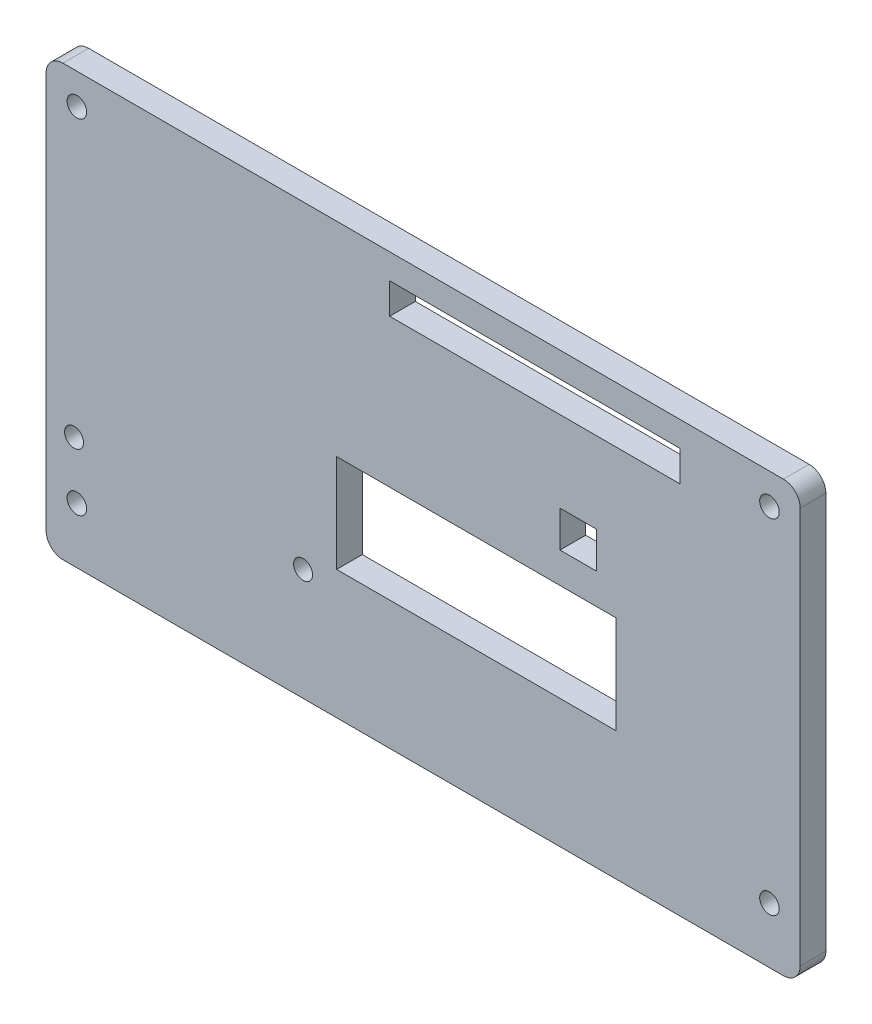
ISO-10303-21;
HEADER;
FILE_DESCRIPTION(('STEP AP214'),'2;1');
FILE_NAME('part.step','',(''),(''),'','','');
FILE_SCHEMA(('AUTOMOTIVE_DESIGN { 1 0 10303 214 1 1 1 1 }'));
ENDSEC;
DATA;
#1=APPLICATION_CONTEXT('core data for automotive mechanical design processes');
#2=APPLICATION_PROTOCOL_DEFINITION('international standard','automotive_design',2000,#1);
#3=PRODUCT_CONTEXT('',#1,'mechanical');
#4=PRODUCT('Part','Part','',(#3));
#5=PRODUCT_RELATED_PRODUCT_CATEGORY('part','',(#4));
#6=PRODUCT_DEFINITION_FORMATION('','',#4);
#7=PRODUCT_DEFINITION_CONTEXT('part definition',#1,'design');
#8=PRODUCT_DEFINITION('design','',#6,#7);
#9=PRODUCT_DEFINITION_SHAPE('','',#8);
#10=(LENGTH_UNIT() NAMED_UNIT(*) SI_UNIT(.MILLI.,.METRE.));
#11=(NAMED_UNIT(*) PLANE_ANGLE_UNIT() SI_UNIT($,.RADIAN.));
#12=(NAMED_UNIT(*) SI_UNIT($,.STERADIAN.) SOLID_ANGLE_UNIT());
#13=UNCERTAINTY_MEASURE_WITH_UNIT(LENGTH_MEASURE(1.E-05),#10,'distance_accuracy_value','');
#14=(GEOMETRIC_REPRESENTATION_CONTEXT(3) GLOBAL_UNCERTAINTY_ASSIGNED_CONTEXT((#13)) GLOBAL_UNIT_ASSIGNED_CONTEXT((#10,
#11,#12)) REPRESENTATION_CONTEXT('',''));
#15=CARTESIAN_POINT('',(0.,0.,0.));
#16=DIRECTION('',(0.,0.,1.));
#17=DIRECTION('',(1.,0.,0.));
#18=AXIS2_PLACEMENT_3D('',#15,#16,#17);
#19=CARTESIAN_POINT('',(7.92481365266042,79.0360065363824,4.6));
#20=DIRECTION('',(0.,0.,1.));
#21=DIRECTION('',(1.,0.,0.));
#22=AXIS2_PLACEMENT_3D('',#19,#20,#21);
#23=PLANE('',#22);
#24=CARTESIAN_POINT('',(50.9248136526604,25.0360065363824,4.6));
#25=DIRECTION('',(0.,0.,-1.));
#26=DIRECTION('',(-1.,0.,0.));
#27=AXIS2_PLACEMENT_3D('',#24,#25,#26);
#28=CIRCLE('',#27,1.7);
#29=CARTESIAN_POINT('',(49.2248136526604,25.0360065363824,4.6));
#30=VERTEX_POINT('',#29);
#31=EDGE_CURVE('E584',#30,#30,#28,.T.);
#32=ORIENTED_EDGE('',*,*,#31,.T.);
#33=EDGE_LOOP('',(#32));
#34=FACE_BOUND('',#33,.T.);
#35=CARTESIAN_POINT('',(9.92481365266042,25.0360065363824,4.6));
#36=DIRECTION('',(0.,0.,-1.));
#37=DIRECTION('',(-1.,0.,0.));
#38=AXIS2_PLACEMENT_3D('',#35,#36,#37);
#39=CIRCLE('',#38,1.7);
#40=CARTESIAN_POINT('',(8.22481365266042,25.0360065363824,4.6));
#41=VERTEX_POINT('',#40);
#42=EDGE_CURVE('E588',#41,#41,#39,.T.);
#43=ORIENTED_EDGE('',*,*,#42,.T.);
#44=EDGE_LOOP('',(#43));
#45=FACE_BOUND('',#44,.T.);
#46=CARTESIAN_POINT('',(10.4248136526604,15.0360065363824,4.6));
#47=DIRECTION('',(0.,0.,1.));
#48=DIRECTION('',(1.,0.,0.));
#49=AXIS2_PLACEMENT_3D('',#46,#47,#48);
#50=CIRCLE('',#49,1.75);
#51=CARTESIAN_POINT('',(12.1748136526604,15.0360065363824,4.6));
#52=VERTEX_POINT('',#51);
#53=EDGE_CURVE('E604',#52,#52,#50,.T.);
#54=ORIENTED_EDGE('',*,*,#53,.F.);
#55=EDGE_LOOP('',(#54));
#56=FACE_BOUND('',#55,.T.);
#57=CARTESIAN_POINT('',(134.42481365266,76.5360065363824,4.6));
#58=DIRECTION('',(0.,0.,1.));
#59=DIRECTION('',(1.,0.,0.));
#60=AXIS2_PLACEMENT_3D('',#57,#58,#59);
#61=CIRCLE('',#60,1.75);
#62=CARTESIAN_POINT('',(136.17481365266,76.5360065363824,4.6));
#63=VERTEX_POINT('',#62);
#64=EDGE_CURVE('E203',#63,#63,#61,.T.);
#65=ORIENTED_EDGE('',*,*,#64,.F.);
#66=EDGE_LOOP('',(#65));
#67=FACE_BOUND('',#66,.T.);
#68=CARTESIAN_POINT('',(7.92481365266042,79.0360065363824,4.6));
#69=DIRECTION('',(0.,0.,1.));
#70=DIRECTION('',(1.,0.,0.));
#71=AXIS2_PLACEMENT_3D('',#68,#69,#70);
#72=CIRCLE('',#71,3.);
#73=CARTESIAN_POINT('',(7.92481365266042,82.0360065363824,4.6));
#74=VERTEX_POINT('',#73);
#75=CARTESIAN_POINT('',(4.92481365266042,79.0360065363824,4.6));
#76=VERTEX_POINT('',#75);
#77=EDGE_CURVE('E275',#74,#76,#72,.T.);
#78=ORIENTED_EDGE('',*,*,#77,.T.);
#79=DIRECTION('',(0.,-1.,0.));
#80=VECTOR('',#79,1.);
#81=CARTESIAN_POINT('',(4.92481365266042,8.03600653638239,4.6));
#82=LINE('',#81,#80);
#83=CARTESIAN_POINT('',(4.92481365266042,8.03600653638239,4.6));
#84=VERTEX_POINT('',#83);
#85=EDGE_CURVE('E278',#76,#84,#82,.T.);
#86=ORIENTED_EDGE('',*,*,#85,.T.);
#87=CARTESIAN_POINT('',(7.92481365266042,8.03600653638239,4.6));
#88=DIRECTION('',(0.,0.,1.));
#89=DIRECTION('',(1.,0.,0.));
#90=AXIS2_PLACEMENT_3D('',#87,#88,#89);
#91=CIRCLE('',#90,3.);
#92=CARTESIAN_POINT('',(7.92481365266042,5.03600653638239,4.6));
#93=VERTEX_POINT('',#92);
#94=EDGE_CURVE('E281',#84,#93,#91,.T.);
#95=ORIENTED_EDGE('',*,*,#94,.T.);
#96=DIRECTION('',(1.,0.,0.));
#97=VECTOR('',#96,1.);
#98=CARTESIAN_POINT('',(136.92481365266,5.03600653638239,4.6));
#99=LINE('',#98,#97);
#100=CARTESIAN_POINT('',(136.92481365266,5.03600653638239,4.6));
#101=VERTEX_POINT('',#100);
#102=EDGE_CURVE('E283',#93,#101,#99,.T.);
#103=ORIENTED_EDGE('',*,*,#102,.T.);
#104=CARTESIAN_POINT('',(136.92481365266,8.0360065363824,4.6));
#105=DIRECTION('',(0.,0.,1.));
#106=DIRECTION('',(1.,0.,0.));
#107=AXIS2_PLACEMENT_3D('',#104,#105,#106);
#108=CIRCLE('',#107,3.);
#109=CARTESIAN_POINT('',(139.92481365266,8.03600653638239,4.6));
#110=VERTEX_POINT('',#109);
#111=EDGE_CURVE('E285',#101,#110,#108,.T.);
#112=ORIENTED_EDGE('',*,*,#111,.T.);
#113=DIRECTION('',(0.,1.,0.));
#114=VECTOR('',#113,1.);
#115=CARTESIAN_POINT('',(139.92481365266,79.0360065363824,4.6));
#116=LINE('',#115,#114);
#117=CARTESIAN_POINT('',(139.92481365266,79.0360065363824,4.6));
#118=VERTEX_POINT('',#117);
#119=EDGE_CURVE('E287',#110,#118,#116,.T.);
#120=ORIENTED_EDGE('',*,*,#119,.T.);
#121=CARTESIAN_POINT('',(136.92481365266,79.0360065363824,4.6));
#122=DIRECTION('',(0.,0.,1.));
#123=DIRECTION('',(1.,0.,0.));
#124=AXIS2_PLACEMENT_3D('',#121,#122,#123);
#125=CIRCLE('',#124,3.);
#126=CARTESIAN_POINT('',(136.92481365266,82.0360065363824,4.6));
#127=VERTEX_POINT('',#126);
#128=EDGE_CURVE('E289',#118,#127,#125,.T.);
#129=ORIENTED_EDGE('',*,*,#128,.T.);
#130=DIRECTION('',(-1.,0.,0.));
#131=VECTOR('',#130,1.);
#132=CARTESIAN_POINT('',(7.92481365266042,82.0360065363824,4.6));
#133=LINE('',#132,#131);
#134=EDGE_CURVE('E291',#127,#74,#133,.T.);
#135=ORIENTED_EDGE('',*,*,#134,.T.);
#136=EDGE_LOOP('',(#78,#86,#95,#103,#112,#120,#129,#135));
#137=FACE_BOUND('',#136,.T.);
#138=DIRECTION('',(1.,0.,0.));
#139=VECTOR('',#138,1.);
#140=CARTESIAN_POINT('',(118.42481365266,72.0360065363824,4.6));
#141=LINE('',#140,#139);
#142=CARTESIAN_POINT('',(66.4248136526604,72.0360065363824,4.6));
#143=VERTEX_POINT('',#142);
#144=CARTESIAN_POINT('',(118.42481365266,72.0360065363824,4.6));
#145=VERTEX_POINT('',#144);
#146=EDGE_CURVE('E246',#143,#145,#141,.T.);
#147=ORIENTED_EDGE('',*,*,#146,.F.);
#148=DIRECTION('',(0.,-1.,0.));
#149=VECTOR('',#148,1.);
#150=CARTESIAN_POINT('',(66.4248136526604,72.0360065363824,4.6));
#151=LINE('',#150,#149);
#152=CARTESIAN_POINT('',(66.4248136526604,77.5360065363824,4.6));
#153=VERTEX_POINT('',#152);
#154=EDGE_CURVE('E244',#153,#143,#151,.T.);
#155=ORIENTED_EDGE('',*,*,#154,.F.);
#156=DIRECTION('',(-1.,0.,0.));
#157=VECTOR('',#156,1.);
#158=CARTESIAN_POINT('',(66.4248136526604,77.5360065363824,4.6));
#159=LINE('',#158,#157);
#160=CARTESIAN_POINT('',(118.42481365266,77.5360065363824,4.6));
#161=VERTEX_POINT('',#160);
#162=EDGE_CURVE('E252',#161,#153,#159,.T.);
#163=ORIENTED_EDGE('',*,*,#162,.F.);
#164=DIRECTION('',(0.,1.,0.));
#165=VECTOR('',#164,1.);
#166=CARTESIAN_POINT('',(118.42481365266,77.5360065363824,4.6));
#167=LINE('',#166,#165);
#168=EDGE_CURVE('E249',#145,#161,#167,.T.);
#169=ORIENTED_EDGE('',*,*,#168,.F.);
#170=EDGE_LOOP('',(#147,#155,#163,#169));
#171=FACE_BOUND('',#170,.T.);
#172=DIRECTION('',(1.,0.,0.));
#173=VECTOR('',#172,1.);
#174=CARTESIAN_POINT('',(106.92481365266,28.0360065363824,4.6));
#175=LINE('',#174,#173);
#176=CARTESIAN_POINT('',(56.9248136526604,28.0360065363824,4.6));
#177=VERTEX_POINT('',#176);
#178=CARTESIAN_POINT('',(106.92481365266,28.0360065363824,4.6));
#179=VERTEX_POINT('',#178);
#180=EDGE_CURVE('E215',#177,#179,#175,.T.);
#181=ORIENTED_EDGE('',*,*,#180,.F.);
#182=DIRECTION('',(0.,-1.,0.));
#183=VECTOR('',#182,1.);
#184=CARTESIAN_POINT('',(56.9248136526604,28.0360065363824,4.6));
#185=LINE('',#184,#183);
#186=CARTESIAN_POINT('',(56.9248136526604,45.5360065363824,4.6));
#187=VERTEX_POINT('',#186);
#188=EDGE_CURVE('E213',#187,#177,#185,.T.);
#189=ORIENTED_EDGE('',*,*,#188,.F.);
#190=DIRECTION('',(-1.,0.,0.));
#191=VECTOR('',#190,1.);
#192=CARTESIAN_POINT('',(56.9248136526604,45.5360065363824,4.6));
#193=LINE('',#192,#191);
#194=CARTESIAN_POINT('',(106.92481365266,45.5360065363824,4.6));
#195=VERTEX_POINT('',#194);
#196=EDGE_CURVE('E221',#195,#187,#193,.T.);
#197=ORIENTED_EDGE('',*,*,#196,.F.);
#198=DIRECTION('',(0.,1.,0.));
#199=VECTOR('',#198,1.);
#200=CARTESIAN_POINT('',(106.92481365266,45.5360065363824,4.6));
#201=LINE('',#200,#199);
#202=EDGE_CURVE('E218',#179,#195,#201,.T.);
#203=ORIENTED_EDGE('',*,*,#202,.F.);
#204=EDGE_LOOP('',(#181,#189,#197,#203));
#205=FACE_BOUND('',#204,.T.);
#206=DIRECTION('',(1.,0.,0.));
#207=VECTOR('',#206,1.);
#208=CARTESIAN_POINT('',(103.42481365266,51.0360065363824,4.6));
#209=LINE('',#208,#207);
#210=CARTESIAN_POINT('',(96.9248136526604,51.0360065363824,4.6));
#211=VERTEX_POINT('',#210);
#212=CARTESIAN_POINT('',(103.42481365266,51.0360065363824,4.6));
#213=VERTEX_POINT('',#212);
#214=EDGE_CURVE('E182',#211,#213,#209,.T.);
#215=ORIENTED_EDGE('',*,*,#214,.F.);
#216=DIRECTION('',(0.,-1.,0.));
#217=VECTOR('',#216,1.);
#218=CARTESIAN_POINT('',(96.9248136526604,51.0360065363824,4.6));
#219=LINE('',#218,#217);
#220=CARTESIAN_POINT('',(96.9248136526604,57.5360065363824,4.6));
#221=VERTEX_POINT('',#220);
#222=EDGE_CURVE('E174',#221,#211,#219,.T.);
#223=ORIENTED_EDGE('',*,*,#222,.F.);
#224=DIRECTION('',(-1.,0.,0.));
#225=VECTOR('',#224,1.);
#226=CARTESIAN_POINT('',(96.9248136526604,57.5360065363824,4.6));
#227=LINE('',#226,#225);
#228=CARTESIAN_POINT('',(103.42481365266,57.5360065363824,4.6));
#229=VERTEX_POINT('',#228);
#230=EDGE_CURVE('E197',#229,#221,#227,.T.);
#231=ORIENTED_EDGE('',*,*,#230,.F.);
#232=DIRECTION('',(0.,1.,0.));
#233=VECTOR('',#232,1.);
#234=CARTESIAN_POINT('',(103.42481365266,57.5360065363824,4.6));
#235=LINE('',#234,#233);
#236=EDGE_CURVE('E195',#213,#229,#235,.T.);
#237=ORIENTED_EDGE('',*,*,#236,.F.);
#238=EDGE_LOOP('',(#215,#223,#231,#237));
#239=FACE_BOUND('',#238,.T.);
#240=CARTESIAN_POINT('',(10.4248136526604,76.5360065363824,4.6));
#241=DIRECTION('',(0.,0.,1.));
#242=DIRECTION('',(1.,0.,0.));
#243=AXIS2_PLACEMENT_3D('',#240,#241,#242);
#244=CIRCLE('',#243,1.75);
#245=CARTESIAN_POINT('',(12.1748136526604,76.5360065363824,4.6));
#246=VERTEX_POINT('',#245);
#247=EDGE_CURVE('E610',#246,#246,#244,.T.);
#248=ORIENTED_EDGE('',*,*,#247,.F.);
#249=EDGE_LOOP('',(#248));
#250=FACE_BOUND('',#249,.T.);
#251=CARTESIAN_POINT('',(134.42481365266,15.0360065363824,4.6));
#252=DIRECTION('',(0.,0.,1.));
#253=DIRECTION('',(1.,0.,0.));
#254=AXIS2_PLACEMENT_3D('',#251,#252,#253);
#255=CIRCLE('',#254,1.75000000000001);
#256=CARTESIAN_POINT('',(136.17481365266,15.0360065363824,4.6));
#257=VERTEX_POINT('',#256);
#258=EDGE_CURVE('E598',#257,#257,#255,.T.);
#259=ORIENTED_EDGE('',*,*,#258,.F.);
#260=EDGE_LOOP('',(#259));
#261=FACE_BOUND('',#260,.T.);
#262=ADVANCED_FACE('F37',(#34,#45,#56,#67,#137,#171,#205,#239,#250,#261),#23,.T.);
#263=CARTESIAN_POINT('',(7.92481365266042,79.0360065363824,0.));
#264=DIRECTION('',(0.,0.,1.));
#265=DIRECTION('',(1.,0.,0.));
#266=AXIS2_PLACEMENT_3D('',#263,#264,#265);
#267=PLANE('',#266);
#268=CARTESIAN_POINT('',(50.9248136526604,25.0360065363824,0.));
#269=DIRECTION('',(0.,0.,-1.));
#270=DIRECTION('',(-1.,0.,0.));
#271=AXIS2_PLACEMENT_3D('',#268,#269,#270);
#272=CIRCLE('',#271,1.7);
#273=CARTESIAN_POINT('',(49.2248136526604,25.0360065363824,0.));
#274=VERTEX_POINT('',#273);
#275=EDGE_CURVE('E587',#274,#274,#272,.T.);
#276=ORIENTED_EDGE('',*,*,#275,.F.);
#277=EDGE_LOOP('',(#276));
#278=FACE_BOUND('',#277,.T.);
#279=CARTESIAN_POINT('',(9.92481365266042,25.0360065363824,0.));
#280=DIRECTION('',(0.,0.,-1.));
#281=DIRECTION('',(-1.,0.,0.));
#282=AXIS2_PLACEMENT_3D('',#279,#280,#281);
#283=CIRCLE('',#282,1.7);
#284=CARTESIAN_POINT('',(8.22481365266042,25.0360065363824,0.));
#285=VERTEX_POINT('',#284);
#286=EDGE_CURVE('E593',#285,#285,#283,.T.);
#287=ORIENTED_EDGE('',*,*,#286,.F.);
#288=EDGE_LOOP('',(#287));
#289=FACE_BOUND('',#288,.T.);
#290=DIRECTION('',(0.,-1.,0.));
#291=VECTOR('',#290,1.);
#292=CARTESIAN_POINT('',(56.9248136526604,28.0360065363824,0.));
#293=LINE('',#292,#291);
#294=CARTESIAN_POINT('',(56.9248136526604,45.5360065363824,0.));
#295=VERTEX_POINT('',#294);
#296=CARTESIAN_POINT('',(56.9248136526604,28.0360065363824,0.));
#297=VERTEX_POINT('',#296);
#298=EDGE_CURVE('E190',#295,#297,#293,.T.);
#299=ORIENTED_EDGE('',*,*,#298,.T.);
#300=DIRECTION('',(1.,0.,0.));
#301=VECTOR('',#300,1.);
#302=CARTESIAN_POINT('',(106.92481365266,28.0360065363824,0.));
#303=LINE('',#302,#301);
#304=CARTESIAN_POINT('',(106.92481365266,28.0360065363824,0.));
#305=VERTEX_POINT('',#304);
#306=EDGE_CURVE('E226',#297,#305,#303,.T.);
#307=ORIENTED_EDGE('',*,*,#306,.T.);
#308=DIRECTION('',(0.,1.,0.));
#309=VECTOR('',#308,1.);
#310=CARTESIAN_POINT('',(106.92481365266,45.5360065363824,0.));
#311=LINE('',#310,#309);
#312=CARTESIAN_POINT('',(106.92481365266,45.5360065363824,0.));
#313=VERTEX_POINT('',#312);
#314=EDGE_CURVE('E229',#305,#313,#311,.T.);
#315=ORIENTED_EDGE('',*,*,#314,.T.);
#316=DIRECTION('',(-1.,0.,0.));
#317=VECTOR('',#316,1.);
#318=CARTESIAN_POINT('',(56.9248136526604,45.5360065363824,0.));
#319=LINE('',#318,#317);
#320=EDGE_CURVE('E216',#313,#295,#319,.T.);
#321=ORIENTED_EDGE('',*,*,#320,.T.);
#322=EDGE_LOOP('',(#299,#307,#315,#321));
#323=FACE_BOUND('',#322,.T.);
#324=CARTESIAN_POINT('',(7.92481365266042,79.0360065363824,0.));
#325=DIRECTION('',(0.,0.,1.));
#326=DIRECTION('',(1.,0.,0.));
#327=AXIS2_PLACEMENT_3D('',#324,#325,#326);
#328=CIRCLE('',#327,3.);
#329=CARTESIAN_POINT('',(7.92481365266042,82.0360065363824,0.));
#330=VERTEX_POINT('',#329);
#331=CARTESIAN_POINT('',(4.92481365266042,79.0360065363824,0.));
#332=VERTEX_POINT('',#331);
#333=EDGE_CURVE('E274',#330,#332,#328,.T.);
#334=ORIENTED_EDGE('',*,*,#333,.F.);
#335=DIRECTION('',(-1.,0.,0.));
#336=VECTOR('',#335,1.);
#337=CARTESIAN_POINT('',(7.92481365266042,82.0360065363824,0.));
#338=LINE('',#337,#336);
#339=CARTESIAN_POINT('',(136.92481365266,82.0360065363824,0.));
#340=VERTEX_POINT('',#339);
#341=EDGE_CURVE('E279',#340,#330,#338,.T.);
#342=ORIENTED_EDGE('',*,*,#341,.F.);
#343=CARTESIAN_POINT('',(136.92481365266,79.0360065363824,0.));
#344=DIRECTION('',(0.,0.,1.));
#345=DIRECTION('',(1.,0.,0.));
#346=AXIS2_PLACEMENT_3D('',#343,#344,#345);
#347=CIRCLE('',#346,3.);
#348=CARTESIAN_POINT('',(139.92481365266,79.0360065363824,0.));
#349=VERTEX_POINT('',#348);
#350=EDGE_CURVE('E306',#349,#340,#347,.T.);
#351=ORIENTED_EDGE('',*,*,#350,.F.);
#352=DIRECTION('',(0.,1.,0.));
#353=VECTOR('',#352,1.);
#354=CARTESIAN_POINT('',(139.92481365266,79.0360065363824,0.));
#355=LINE('',#354,#353);
#356=CARTESIAN_POINT('',(139.92481365266,8.03600653638239,0.));
#357=VERTEX_POINT('',#356);
#358=EDGE_CURVE('E304',#357,#349,#355,.T.);
#359=ORIENTED_EDGE('',*,*,#358,.F.);
#360=CARTESIAN_POINT('',(136.92481365266,8.0360065363824,0.));
#361=DIRECTION('',(0.,0.,1.));
#362=DIRECTION('',(1.,0.,0.));
#363=AXIS2_PLACEMENT_3D('',#360,#361,#362);
#364=CIRCLE('',#363,3.);
#365=CARTESIAN_POINT('',(136.92481365266,5.03600653638239,0.));
#366=VERTEX_POINT('',#365);
#367=EDGE_CURVE('E302',#366,#357,#364,.T.);
#368=ORIENTED_EDGE('',*,*,#367,.F.);
#369=DIRECTION('',(1.,0.,0.));
#370=VECTOR('',#369,1.);
#371=CARTESIAN_POINT('',(136.92481365266,5.03600653638239,0.));
#372=LINE('',#371,#370);
#373=CARTESIAN_POINT('',(7.92481365266042,5.03600653638239,0.));
#374=VERTEX_POINT('',#373);
#375=EDGE_CURVE('E300',#374,#366,#372,.T.);
#376=ORIENTED_EDGE('',*,*,#375,.F.);
#377=CARTESIAN_POINT('',(7.92481365266042,8.03600653638239,0.));
#378=DIRECTION('',(0.,0.,1.));
#379=DIRECTION('',(1.,0.,0.));
#380=AXIS2_PLACEMENT_3D('',#377,#378,#379);
#381=CIRCLE('',#380,3.);
#382=CARTESIAN_POINT('',(4.92481365266042,8.03600653638239,0.));
#383=VERTEX_POINT('',#382);
#384=EDGE_CURVE('E298',#383,#374,#381,.T.);
#385=ORIENTED_EDGE('',*,*,#384,.F.);
#386=DIRECTION('',(0.,-1.,0.));
#387=VECTOR('',#386,1.);
#388=CARTESIAN_POINT('',(4.92481365266042,8.03600653638239,0.));
#389=LINE('',#388,#387);
#390=EDGE_CURVE('E296',#332,#383,#389,.T.);
#391=ORIENTED_EDGE('',*,*,#390,.F.);
#392=EDGE_LOOP('',(#334,#342,#351,#359,#368,#376,#385,#391));
#393=FACE_BOUND('',#392,.T.);
#394=DIRECTION('',(0.,-1.,0.));
#395=VECTOR('',#394,1.);
#396=CARTESIAN_POINT('',(66.4248136526604,72.0360065363824,0.));
#397=LINE('',#396,#395);
#398=CARTESIAN_POINT('',(66.4248136526604,77.5360065363824,0.));
#399=VERTEX_POINT('',#398);
#400=CARTESIAN_POINT('',(66.4248136526604,72.0360065363824,0.));
#401=VERTEX_POINT('',#400);
#402=EDGE_CURVE('E243',#399,#401,#397,.T.);
#403=ORIENTED_EDGE('',*,*,#402,.T.);
#404=DIRECTION('',(1.,0.,0.));
#405=VECTOR('',#404,1.);
#406=CARTESIAN_POINT('',(118.42481365266,72.0360065363824,0.));
#407=LINE('',#406,#405);
#408=CARTESIAN_POINT('',(118.42481365266,72.0360065363824,0.));
#409=VERTEX_POINT('',#408);
#410=EDGE_CURVE('E257',#401,#409,#407,.T.);
#411=ORIENTED_EDGE('',*,*,#410,.T.);
#412=DIRECTION('',(0.,1.,0.));
#413=VECTOR('',#412,1.);
#414=CARTESIAN_POINT('',(118.42481365266,77.5360065363824,0.));
#415=LINE('',#414,#413);
#416=CARTESIAN_POINT('',(118.42481365266,77.5360065363824,0.));
#417=VERTEX_POINT('',#416);
#418=EDGE_CURVE('E260',#409,#417,#415,.T.);
#419=ORIENTED_EDGE('',*,*,#418,.T.);
#420=DIRECTION('',(-1.,0.,0.));
#421=VECTOR('',#420,1.);
#422=CARTESIAN_POINT('',(66.4248136526604,77.5360065363824,0.));
#423=LINE('',#422,#421);
#424=EDGE_CURVE('E247',#417,#399,#423,.T.);
#425=ORIENTED_EDGE('',*,*,#424,.T.);
#426=EDGE_LOOP('',(#403,#411,#419,#425));
#427=FACE_BOUND('',#426,.T.);
#428=DIRECTION('',(0.,-1.,0.));
#429=VECTOR('',#428,1.);
#430=CARTESIAN_POINT('',(96.9248136526604,51.0360065363824,0.));
#431=LINE('',#430,#429);
#432=CARTESIAN_POINT('',(96.9248136526604,57.5360065363824,0.));
#433=VERTEX_POINT('',#432);
#434=CARTESIAN_POINT('',(96.9248136526604,51.0360065363824,0.));
#435=VERTEX_POINT('',#434);
#436=EDGE_CURVE('E60',#433,#435,#431,.T.);
#437=ORIENTED_EDGE('',*,*,#436,.T.);
#438=DIRECTION('',(1.,0.,0.));
#439=VECTOR('',#438,1.);
#440=CARTESIAN_POINT('',(103.42481365266,51.0360065363824,0.));
#441=LINE('',#440,#439);
#442=CARTESIAN_POINT('',(103.42481365266,51.0360065363824,0.));
#443=VERTEX_POINT('',#442);
#444=EDGE_CURVE('E189',#435,#443,#441,.T.);
#445=ORIENTED_EDGE('',*,*,#444,.T.);
#446=DIRECTION('',(0.,1.,0.));
#447=VECTOR('',#446,1.);
#448=CARTESIAN_POINT('',(103.42481365266,57.5360065363824,0.));
#449=LINE('',#448,#447);
#450=CARTESIAN_POINT('',(103.42481365266,57.5360065363824,0.));
#451=VERTEX_POINT('',#450);
#452=EDGE_CURVE('E205',#443,#451,#449,.T.);
#453=ORIENTED_EDGE('',*,*,#452,.T.);
#454=DIRECTION('',(-1.,0.,0.));
#455=VECTOR('',#454,1.);
#456=CARTESIAN_POINT('',(96.9248136526604,57.5360065363824,0.));
#457=LINE('',#456,#455);
#458=EDGE_CURVE('E183',#451,#433,#457,.T.);
#459=ORIENTED_EDGE('',*,*,#458,.T.);
#460=EDGE_LOOP('',(#437,#445,#453,#459));
#461=FACE_BOUND('',#460,.T.);
#462=CARTESIAN_POINT('',(134.42481365266,76.5360065363824,0.));
#463=DIRECTION('',(0.,0.,1.));
#464=DIRECTION('',(1.,0.,0.));
#465=AXIS2_PLACEMENT_3D('',#462,#463,#464);
#466=CIRCLE('',#465,1.75);
#467=CARTESIAN_POINT('',(136.17481365266,76.5360065363824,0.));
#468=VERTEX_POINT('',#467);
#469=EDGE_CURVE('E613',#468,#468,#466,.T.);
#470=ORIENTED_EDGE('',*,*,#469,.T.);
#471=EDGE_LOOP('',(#470));
#472=FACE_BOUND('',#471,.T.);
#473=CARTESIAN_POINT('',(10.4248136526604,76.5360065363824,0.));
#474=DIRECTION('',(0.,0.,1.));
#475=DIRECTION('',(1.,0.,0.));
#476=AXIS2_PLACEMENT_3D('',#473,#474,#475);
#477=CIRCLE('',#476,1.75);
#478=CARTESIAN_POINT('',(12.1748136526604,76.5360065363824,0.));
#479=VERTEX_POINT('',#478);
#480=EDGE_CURVE('E607',#479,#479,#477,.T.);
#481=ORIENTED_EDGE('',*,*,#480,.T.);
#482=EDGE_LOOP('',(#481));
#483=FACE_BOUND('',#482,.T.);
#484=CARTESIAN_POINT('',(10.4248136526604,15.0360065363824,0.));
#485=DIRECTION('',(0.,0.,1.));
#486=DIRECTION('',(1.,0.,0.));
#487=AXIS2_PLACEMENT_3D('',#484,#485,#486);
#488=CIRCLE('',#487,1.75);
#489=CARTESIAN_POINT('',(12.1748136526604,15.0360065363824,0.));
#490=VERTEX_POINT('',#489);
#491=EDGE_CURVE('E601',#490,#490,#488,.T.);
#492=ORIENTED_EDGE('',*,*,#491,.T.);
#493=EDGE_LOOP('',(#492));
#494=FACE_BOUND('',#493,.T.);
#495=CARTESIAN_POINT('',(134.42481365266,15.0360065363824,0.));
#496=DIRECTION('',(0.,0.,1.));
#497=DIRECTION('',(1.,0.,0.));
#498=AXIS2_PLACEMENT_3D('',#495,#496,#497);
#499=CIRCLE('',#498,1.75000000000001);
#500=CARTESIAN_POINT('',(136.17481365266,15.0360065363824,0.));
#501=VERTEX_POINT('',#500);
#502=EDGE_CURVE('E590',#501,#501,#499,.T.);
#503=ORIENTED_EDGE('',*,*,#502,.T.);
#504=EDGE_LOOP('',(#503));
#505=FACE_BOUND('',#504,.T.);
#506=ADVANCED_FACE('F336',(#278,#289,#323,#393,#427,#461,#472,#483,#494,#505),#267,.F.);
#507=CARTESIAN_POINT('',(7.92481365266042,79.0360065363824,4.6));
#508=DIRECTION('',(0.,0.,-1.));
#509=DIRECTION('',(-1.,0.,0.));
#510=AXIS2_PLACEMENT_3D('',#507,#508,#509);
#511=CYLINDRICAL_SURFACE('',#510,3.);
#512=ORIENTED_EDGE('',*,*,#333,.T.);
#513=DIRECTION('',(0.,0.,-1.));
#514=VECTOR('',#513,1.);
#515=CARTESIAN_POINT('',(4.92481365266042,79.0360065363824,4.6));
#516=LINE('',#515,#514);
#517=EDGE_CURVE('E11',#76,#332,#516,.T.);
#518=ORIENTED_EDGE('',*,*,#517,.F.);
#519=ORIENTED_EDGE('',*,*,#77,.F.);
#520=DIRECTION('',(0.,0.,-1.));
#521=VECTOR('',#520,1.);
#522=CARTESIAN_POINT('',(7.92481365266042,82.0360065363824,4.6));
#523=LINE('',#522,#521);
#524=EDGE_CURVE('E293',#74,#330,#523,.T.);
#525=ORIENTED_EDGE('',*,*,#524,.T.);
#526=EDGE_LOOP('',(#512,#518,#519,#525));
#527=FACE_BOUND('',#526,.T.);
#528=ADVANCED_FACE('F39',(#527),#511,.T.);
#529=CARTESIAN_POINT('',(4.92481365266042,8.03600653638239,4.6));
#530=DIRECTION('',(1.,0.,0.));
#531=DIRECTION('',(0.,0.,-1.));
#532=AXIS2_PLACEMENT_3D('',#529,#530,#531);
#533=PLANE('',#532);
#534=ORIENTED_EDGE('',*,*,#390,.T.);
#535=DIRECTION('',(0.,0.,-1.));
#536=VECTOR('',#535,1.);
#537=CARTESIAN_POINT('',(4.92481365266042,8.03600653638239,4.6));
#538=LINE('',#537,#536);
#539=EDGE_CURVE('E45',#84,#383,#538,.T.);
#540=ORIENTED_EDGE('',*,*,#539,.F.);
#541=ORIENTED_EDGE('',*,*,#85,.F.);
#542=ORIENTED_EDGE('',*,*,#517,.T.);
#543=EDGE_LOOP('',(#534,#540,#541,#542));
#544=FACE_BOUND('',#543,.T.);
#545=ADVANCED_FACE('F354',(#544),#533,.F.);
#546=CARTESIAN_POINT('',(7.92481365266042,8.03600653638239,4.6));
#547=DIRECTION('',(0.,0.,-1.));
#548=DIRECTION('',(-1.,0.,0.));
#549=AXIS2_PLACEMENT_3D('',#546,#547,#548);
#550=CYLINDRICAL_SURFACE('',#549,3.);
#551=ORIENTED_EDGE('',*,*,#384,.T.);
#552=DIRECTION('',(0.,0.,-1.));
#553=VECTOR('',#552,1.);
#554=CARTESIAN_POINT('',(7.92481365266042,5.03600653638239,4.6));
#555=LINE('',#554,#553);
#556=EDGE_CURVE('E323',#93,#374,#555,.T.);
#557=ORIENTED_EDGE('',*,*,#556,.F.);
#558=ORIENTED_EDGE('',*,*,#94,.F.);
#559=ORIENTED_EDGE('',*,*,#539,.T.);
#560=EDGE_LOOP('',(#551,#557,#558,#559));
#561=FACE_BOUND('',#560,.T.);
#562=ADVANCED_FACE('F330',(#561),#550,.T.);
#563=CARTESIAN_POINT('',(136.92481365266,5.03600653638239,4.6));
#564=DIRECTION('',(0.,1.,0.));
#565=DIRECTION('',(0.,0.,1.));
#566=AXIS2_PLACEMENT_3D('',#563,#564,#565);
#567=PLANE('',#566);
#568=ORIENTED_EDGE('',*,*,#375,.T.);
#569=DIRECTION('',(0.,0.,-1.));
#570=VECTOR('',#569,1.);
#571=CARTESIAN_POINT('',(136.92481365266,5.03600653638239,4.6));
#572=LINE('',#571,#570);
#573=EDGE_CURVE('E320',#101,#366,#572,.T.);
#574=ORIENTED_EDGE('',*,*,#573,.F.);
#575=ORIENTED_EDGE('',*,*,#102,.F.);
#576=ORIENTED_EDGE('',*,*,#556,.T.);
#577=EDGE_LOOP('',(#568,#574,#575,#576));
#578=FACE_BOUND('',#577,.T.);
#579=ADVANCED_FACE('F342',(#578),#567,.F.);
#580=CARTESIAN_POINT('',(136.92481365266,8.0360065363824,4.6));
#581=DIRECTION('',(0.,0.,-1.));
#582=DIRECTION('',(-1.,0.,0.));
#583=AXIS2_PLACEMENT_3D('',#580,#581,#582);
#584=CYLINDRICAL_SURFACE('',#583,3.);
#585=ORIENTED_EDGE('',*,*,#367,.T.);
#586=DIRECTION('',(0.,0.,-1.));
#587=VECTOR('',#586,1.);
#588=CARTESIAN_POINT('',(139.92481365266,8.03600653638239,4.6));
#589=LINE('',#588,#587);
#590=EDGE_CURVE('E317',#110,#357,#589,.T.);
#591=ORIENTED_EDGE('',*,*,#590,.F.);
#592=ORIENTED_EDGE('',*,*,#111,.F.);
#593=ORIENTED_EDGE('',*,*,#573,.T.);
#594=EDGE_LOOP('',(#585,#591,#592,#593));
#595=FACE_BOUND('',#594,.T.);
#596=ADVANCED_FACE('F346',(#595),#584,.T.);
#597=CARTESIAN_POINT('',(139.92481365266,79.0360065363824,4.6));
#598=DIRECTION('',(-1.,0.,0.));
#599=DIRECTION('',(0.,0.,1.));
#600=AXIS2_PLACEMENT_3D('',#597,#598,#599);
#601=PLANE('',#600);
#602=ORIENTED_EDGE('',*,*,#358,.T.);
#603=DIRECTION('',(0.,0.,-1.));
#604=VECTOR('',#603,1.);
#605=CARTESIAN_POINT('',(139.92481365266,79.0360065363824,4.6));
#606=LINE('',#605,#604);
#607=EDGE_CURVE('E314',#118,#349,#606,.T.);
#608=ORIENTED_EDGE('',*,*,#607,.F.);
#609=ORIENTED_EDGE('',*,*,#119,.F.);
#610=ORIENTED_EDGE('',*,*,#590,.T.);
#611=EDGE_LOOP('',(#602,#608,#609,#610));
#612=FACE_BOUND('',#611,.T.);
#613=ADVANCED_FACE('F367',(#612),#601,.F.);
#614=CARTESIAN_POINT('',(136.92481365266,79.0360065363824,4.6));
#615=DIRECTION('',(0.,0.,-1.));
#616=DIRECTION('',(-1.,0.,0.));
#617=AXIS2_PLACEMENT_3D('',#614,#615,#616);
#618=CYLINDRICAL_SURFACE('',#617,3.);
#619=ORIENTED_EDGE('',*,*,#350,.T.);
#620=DIRECTION('',(0.,0.,-1.));
#621=VECTOR('',#620,1.);
#622=CARTESIAN_POINT('',(136.92481365266,82.0360065363824,4.6));
#623=LINE('',#622,#621);
#624=EDGE_CURVE('E311',#127,#340,#623,.T.);
#625=ORIENTED_EDGE('',*,*,#624,.F.);
#626=ORIENTED_EDGE('',*,*,#128,.F.);
#627=ORIENTED_EDGE('',*,*,#607,.T.);
#628=EDGE_LOOP('',(#619,#625,#626,#627));
#629=FACE_BOUND('',#628,.T.);
#630=ADVANCED_FACE('F365',(#629),#618,.T.);
#631=CARTESIAN_POINT('',(7.92481365266042,82.0360065363824,4.6));
#632=DIRECTION('',(0.,-1.,0.));
#633=DIRECTION('',(0.,0.,-1.));
#634=AXIS2_PLACEMENT_3D('',#631,#632,#633);
#635=PLANE('',#634);
#636=ORIENTED_EDGE('',*,*,#341,.T.);
#637=ORIENTED_EDGE('',*,*,#524,.F.);
#638=ORIENTED_EDGE('',*,*,#134,.F.);
#639=ORIENTED_EDGE('',*,*,#624,.T.);
#640=EDGE_LOOP('',(#636,#637,#638,#639));
#641=FACE_BOUND('',#640,.T.);
#642=ADVANCED_FACE('F360',(#641),#635,.F.);
#643=CARTESIAN_POINT('',(66.4248136526604,72.0360065363824,4.6));
#644=DIRECTION('',(1.,0.,0.));
#645=DIRECTION('',(0.,0.,-1.));
#646=AXIS2_PLACEMENT_3D('',#643,#644,#645);
#647=PLANE('',#646);
#648=ORIENTED_EDGE('',*,*,#402,.F.);
#649=DIRECTION('',(0.,0.,-1.));
#650=VECTOR('',#649,1.);
#651=CARTESIAN_POINT('',(66.4248136526604,77.5360065363824,4.6));
#652=LINE('',#651,#650);
#653=EDGE_CURVE('E254',#153,#399,#652,.T.);
#654=ORIENTED_EDGE('',*,*,#653,.F.);
#655=ORIENTED_EDGE('',*,*,#154,.T.);
#656=DIRECTION('',(0.,0.,-1.));
#657=VECTOR('',#656,1.);
#658=CARTESIAN_POINT('',(66.4248136526604,72.0360065363824,4.6));
#659=LINE('',#658,#657);
#660=EDGE_CURVE('E271',#143,#401,#659,.T.);
#661=ORIENTED_EDGE('',*,*,#660,.T.);
#662=EDGE_LOOP('',(#648,#654,#655,#661));
#663=FACE_BOUND('',#662,.T.);
#664=ADVANCED_FACE('F387',(#663),#647,.T.);
#665=CARTESIAN_POINT('',(118.42481365266,72.0360065363824,4.6));
#666=DIRECTION('',(0.,1.,0.));
#667=DIRECTION('',(0.,0.,1.));
#668=AXIS2_PLACEMENT_3D('',#665,#666,#667);
#669=PLANE('',#668);
#670=ORIENTED_EDGE('',*,*,#410,.F.);
#671=ORIENTED_EDGE('',*,*,#660,.F.);
#672=ORIENTED_EDGE('',*,*,#146,.T.);
#673=DIRECTION('',(0.,0.,-1.));
#674=VECTOR('',#673,1.);
#675=CARTESIAN_POINT('',(118.42481365266,72.0360065363824,4.6));
#676=LINE('',#675,#674);
#677=EDGE_CURVE('E269',#145,#409,#676,.T.);
#678=ORIENTED_EDGE('',*,*,#677,.T.);
#679=EDGE_LOOP('',(#670,#671,#672,#678));
#680=FACE_BOUND('',#679,.T.);
#681=ADVANCED_FACE('F394',(#680),#669,.T.);
#682=CARTESIAN_POINT('',(118.42481365266,77.5360065363824,4.6));
#683=DIRECTION('',(-1.,0.,0.));
#684=DIRECTION('',(0.,0.,1.));
#685=AXIS2_PLACEMENT_3D('',#682,#683,#684);
#686=PLANE('',#685);
#687=ORIENTED_EDGE('',*,*,#418,.F.);
#688=ORIENTED_EDGE('',*,*,#677,.F.);
#689=ORIENTED_EDGE('',*,*,#168,.T.);
#690=DIRECTION('',(0.,0.,-1.));
#691=VECTOR('',#690,1.);
#692=CARTESIAN_POINT('',(118.42481365266,77.5360065363824,4.6));
#693=LINE('',#692,#691);
#694=EDGE_CURVE('E267',#161,#417,#693,.T.);
#695=ORIENTED_EDGE('',*,*,#694,.T.);
#696=EDGE_LOOP('',(#687,#688,#689,#695));
#697=FACE_BOUND('',#696,.T.);
#698=ADVANCED_FACE('F399',(#697),#686,.T.);
#699=CARTESIAN_POINT('',(66.4248136526604,77.5360065363824,4.6));
#700=DIRECTION('',(0.,-1.,0.));
#701=DIRECTION('',(0.,0.,-1.));
#702=AXIS2_PLACEMENT_3D('',#699,#700,#701);
#703=PLANE('',#702);
#704=ORIENTED_EDGE('',*,*,#424,.F.);
#705=ORIENTED_EDGE('',*,*,#694,.F.);
#706=ORIENTED_EDGE('',*,*,#162,.T.);
#707=ORIENTED_EDGE('',*,*,#653,.T.);
#708=EDGE_LOOP('',(#704,#705,#706,#707));
#709=FACE_BOUND('',#708,.T.);
#710=ADVANCED_FACE('F406',(#709),#703,.T.);
#711=CARTESIAN_POINT('',(56.9248136526604,28.0360065363824,4.6));
#712=DIRECTION('',(1.,0.,0.));
#713=DIRECTION('',(0.,0.,-1.));
#714=AXIS2_PLACEMENT_3D('',#711,#712,#713);
#715=PLANE('',#714);
#716=ORIENTED_EDGE('',*,*,#298,.F.);
#717=DIRECTION('',(0.,0.,-1.));
#718=VECTOR('',#717,1.);
#719=CARTESIAN_POINT('',(56.9248136526604,45.5360065363824,4.6));
#720=LINE('',#719,#718);
#721=EDGE_CURVE('E223',#187,#295,#720,.T.);
#722=ORIENTED_EDGE('',*,*,#721,.F.);
#723=ORIENTED_EDGE('',*,*,#188,.T.);
#724=DIRECTION('',(0.,0.,-1.));
#725=VECTOR('',#724,1.);
#726=CARTESIAN_POINT('',(56.9248136526604,28.0360065363824,4.6));
#727=LINE('',#726,#725);
#728=EDGE_CURVE('E240',#177,#297,#727,.T.);
#729=ORIENTED_EDGE('',*,*,#728,.T.);
#730=EDGE_LOOP('',(#716,#722,#723,#729));
#731=FACE_BOUND('',#730,.T.);
#732=ADVANCED_FACE('F429',(#731),#715,.T.);
#733=CARTESIAN_POINT('',(106.92481365266,28.0360065363824,4.6));
#734=DIRECTION('',(0.,1.,0.));
#735=DIRECTION('',(0.,0.,1.));
#736=AXIS2_PLACEMENT_3D('',#733,#734,#735);
#737=PLANE('',#736);
#738=ORIENTED_EDGE('',*,*,#306,.F.);
#739=ORIENTED_EDGE('',*,*,#728,.F.);
#740=ORIENTED_EDGE('',*,*,#180,.T.);
#741=DIRECTION('',(0.,0.,-1.));
#742=VECTOR('',#741,1.);
#743=CARTESIAN_POINT('',(106.92481365266,28.0360065363824,4.6));
#744=LINE('',#743,#742);
#745=EDGE_CURVE('E238',#179,#305,#744,.T.);
#746=ORIENTED_EDGE('',*,*,#745,.T.);
#747=EDGE_LOOP('',(#738,#739,#740,#746));
#748=FACE_BOUND('',#747,.T.);
#749=ADVANCED_FACE('F422',(#748),#737,.T.);
#750=CARTESIAN_POINT('',(106.92481365266,45.5360065363824,4.6));
#751=DIRECTION('',(-1.,0.,0.));
#752=DIRECTION('',(0.,0.,1.));
#753=AXIS2_PLACEMENT_3D('',#750,#751,#752);
#754=PLANE('',#753);
#755=ORIENTED_EDGE('',*,*,#314,.F.);
#756=ORIENTED_EDGE('',*,*,#745,.F.);
#757=ORIENTED_EDGE('',*,*,#202,.T.);
#758=DIRECTION('',(0.,0.,-1.));
#759=VECTOR('',#758,1.);
#760=CARTESIAN_POINT('',(106.92481365266,45.5360065363824,4.6));
#761=LINE('',#760,#759);
#762=EDGE_CURVE('E236',#195,#313,#761,.T.);
#763=ORIENTED_EDGE('',*,*,#762,.T.);
#764=EDGE_LOOP('',(#755,#756,#757,#763));
#765=FACE_BOUND('',#764,.T.);
#766=ADVANCED_FACE('F425',(#765),#754,.T.);
#767=CARTESIAN_POINT('',(56.9248136526604,45.5360065363824,4.6));
#768=DIRECTION('',(0.,-1.,0.));
#769=DIRECTION('',(0.,0.,-1.));
#770=AXIS2_PLACEMENT_3D('',#767,#768,#769);
#771=PLANE('',#770);
#772=ORIENTED_EDGE('',*,*,#320,.F.);
#773=ORIENTED_EDGE('',*,*,#762,.F.);
#774=ORIENTED_EDGE('',*,*,#196,.T.);
#775=ORIENTED_EDGE('',*,*,#721,.T.);
#776=EDGE_LOOP('',(#772,#773,#774,#775));
#777=FACE_BOUND('',#776,.T.);
#778=ADVANCED_FACE('F432',(#777),#771,.T.);
#779=CARTESIAN_POINT('',(96.9248136526604,51.0360065363824,4.6));
#780=DIRECTION('',(1.,0.,0.));
#781=DIRECTION('',(0.,0.,-1.));
#782=AXIS2_PLACEMENT_3D('',#779,#780,#781);
#783=PLANE('',#782);
#784=ORIENTED_EDGE('',*,*,#436,.F.);
#785=DIRECTION('',(0.,0.,-1.));
#786=VECTOR('',#785,1.);
#787=CARTESIAN_POINT('',(96.9248136526604,57.5360065363824,4.6));
#788=LINE('',#787,#786);
#789=EDGE_CURVE('E178',#221,#433,#788,.T.);
#790=ORIENTED_EDGE('',*,*,#789,.F.);
#791=ORIENTED_EDGE('',*,*,#222,.T.);
#792=DIRECTION('',(0.,0.,-1.));
#793=VECTOR('',#792,1.);
#794=CARTESIAN_POINT('',(96.9248136526604,51.0360065363824,4.6));
#795=LINE('',#794,#793);
#796=EDGE_CURVE('E177',#211,#435,#795,.T.);
#797=ORIENTED_EDGE('',*,*,#796,.T.);
#798=EDGE_LOOP('',(#784,#790,#791,#797));
#799=FACE_BOUND('',#798,.T.);
#800=ADVANCED_FACE('F176',(#799),#783,.T.);
#801=CARTESIAN_POINT('',(103.42481365266,51.0360065363824,4.6));
#802=DIRECTION('',(0.,1.,0.));
#803=DIRECTION('',(0.,0.,1.));
#804=AXIS2_PLACEMENT_3D('',#801,#802,#803);
#805=PLANE('',#804);
#806=ORIENTED_EDGE('',*,*,#444,.F.);
#807=ORIENTED_EDGE('',*,*,#796,.F.);
#808=ORIENTED_EDGE('',*,*,#214,.T.);
#809=DIRECTION('',(0.,0.,-1.));
#810=VECTOR('',#809,1.);
#811=CARTESIAN_POINT('',(103.42481365266,51.0360065363824,4.6));
#812=LINE('',#811,#810);
#813=EDGE_CURVE('E191',#213,#443,#812,.T.);
#814=ORIENTED_EDGE('',*,*,#813,.T.);
#815=EDGE_LOOP('',(#806,#807,#808,#814));
#816=FACE_BOUND('',#815,.T.);
#817=ADVANCED_FACE('F186',(#816),#805,.T.);
#818=CARTESIAN_POINT('',(103.42481365266,57.5360065363824,4.6));
#819=DIRECTION('',(-1.,0.,0.));
#820=DIRECTION('',(0.,0.,1.));
#821=AXIS2_PLACEMENT_3D('',#818,#819,#820);
#822=PLANE('',#821);
#823=ORIENTED_EDGE('',*,*,#452,.F.);
#824=ORIENTED_EDGE('',*,*,#813,.F.);
#825=ORIENTED_EDGE('',*,*,#236,.T.);
#826=DIRECTION('',(0.,0.,-1.));
#827=VECTOR('',#826,1.);
#828=CARTESIAN_POINT('',(103.42481365266,57.5360065363824,4.6));
#829=LINE('',#828,#827);
#830=EDGE_CURVE('E52',#229,#451,#829,.T.);
#831=ORIENTED_EDGE('',*,*,#830,.T.);
#832=EDGE_LOOP('',(#823,#824,#825,#831));
#833=FACE_BOUND('',#832,.T.);
#834=ADVANCED_FACE('F489',(#833),#822,.T.);
#835=CARTESIAN_POINT('',(96.9248136526604,57.5360065363824,4.6));
#836=DIRECTION('',(0.,-1.,0.));
#837=DIRECTION('',(0.,0.,-1.));
#838=AXIS2_PLACEMENT_3D('',#835,#836,#837);
#839=PLANE('',#838);
#840=ORIENTED_EDGE('',*,*,#458,.F.);
#841=ORIENTED_EDGE('',*,*,#830,.F.);
#842=ORIENTED_EDGE('',*,*,#230,.T.);
#843=ORIENTED_EDGE('',*,*,#789,.T.);
#844=EDGE_LOOP('',(#840,#841,#842,#843));
#845=FACE_BOUND('',#844,.T.);
#846=ADVANCED_FACE('F497',(#845),#839,.T.);
#847=CARTESIAN_POINT('',(134.42481365266,76.5360065363824,4.6));
#848=DIRECTION('',(0.,0.,-1.));
#849=DIRECTION('',(-1.,0.,0.));
#850=AXIS2_PLACEMENT_3D('',#847,#848,#849);
#851=CYLINDRICAL_SURFACE('',#850,1.75);
#852=ORIENTED_EDGE('',*,*,#64,.T.);
#853=EDGE_LOOP('',(#852));
#854=FACE_BOUND('',#853,.T.);
#855=ORIENTED_EDGE('',*,*,#469,.F.);
#856=EDGE_LOOP('',(#855));
#857=FACE_BOUND('',#856,.T.);
#858=ADVANCED_FACE('F507',(#854,#857),#851,.F.);
#859=CARTESIAN_POINT('',(10.4248136526604,76.5360065363824,4.6));
#860=DIRECTION('',(0.,0.,-1.));
#861=DIRECTION('',(-1.,0.,0.));
#862=AXIS2_PLACEMENT_3D('',#859,#860,#861);
#863=CYLINDRICAL_SURFACE('',#862,1.75);
#864=ORIENTED_EDGE('',*,*,#247,.T.);
#865=EDGE_LOOP('',(#864));
#866=FACE_BOUND('',#865,.T.);
#867=ORIENTED_EDGE('',*,*,#480,.F.);
#868=EDGE_LOOP('',(#867));
#869=FACE_BOUND('',#868,.T.);
#870=ADVANCED_FACE('F516',(#866,#869),#863,.F.);
#871=CARTESIAN_POINT('',(10.4248136526604,15.0360065363824,4.6));
#872=DIRECTION('',(0.,0.,-1.));
#873=DIRECTION('',(-1.,0.,0.));
#874=AXIS2_PLACEMENT_3D('',#871,#872,#873);
#875=CYLINDRICAL_SURFACE('',#874,1.75);
#876=ORIENTED_EDGE('',*,*,#53,.T.);
#877=EDGE_LOOP('',(#876));
#878=FACE_BOUND('',#877,.T.);
#879=ORIENTED_EDGE('',*,*,#491,.F.);
#880=EDGE_LOOP('',(#879));
#881=FACE_BOUND('',#880,.T.);
#882=ADVANCED_FACE('F526',(#878,#881),#875,.F.);
#883=CARTESIAN_POINT('',(134.42481365266,15.0360065363824,4.6));
#884=DIRECTION('',(0.,0.,-1.));
#885=DIRECTION('',(-1.,0.,0.));
#886=AXIS2_PLACEMENT_3D('',#883,#884,#885);
#887=CYLINDRICAL_SURFACE('',#886,1.75000000000001);
#888=ORIENTED_EDGE('',*,*,#258,.T.);
#889=EDGE_LOOP('',(#888));
#890=FACE_BOUND('',#889,.T.);
#891=ORIENTED_EDGE('',*,*,#502,.F.);
#892=EDGE_LOOP('',(#891));
#893=FACE_BOUND('',#892,.T.);
#894=ADVANCED_FACE('F536',(#890,#893),#887,.F.);
#895=CARTESIAN_POINT('',(9.92481365266042,25.0360065363824,4.6));
#896=DIRECTION('',(0.,0.,-1.));
#897=DIRECTION('',(-1.,0.,0.));
#898=AXIS2_PLACEMENT_3D('',#895,#896,#897);
#899=CYLINDRICAL_SURFACE('',#898,1.7);
#900=ORIENTED_EDGE('',*,*,#42,.F.);
#901=EDGE_LOOP('',(#900));
#902=FACE_BOUND('',#901,.T.);
#903=ORIENTED_EDGE('',*,*,#286,.T.);
#904=EDGE_LOOP('',(#903));
#905=FACE_BOUND('',#904,.T.);
#906=ADVANCED_FACE('F545',(#902,#905),#899,.F.);
#907=CARTESIAN_POINT('',(50.9248136526604,25.0360065363824,4.6));
#908=DIRECTION('',(0.,0.,-1.));
#909=DIRECTION('',(-1.,0.,0.));
#910=AXIS2_PLACEMENT_3D('',#907,#908,#909);
#911=CYLINDRICAL_SURFACE('',#910,1.7);
#912=ORIENTED_EDGE('',*,*,#31,.F.);
#913=EDGE_LOOP('',(#912));
#914=FACE_BOUND('',#913,.T.);
#915=ORIENTED_EDGE('',*,*,#275,.T.);
#916=EDGE_LOOP('',(#915));
#917=FACE_BOUND('',#916,.T.);
#918=ADVANCED_FACE('F568',(#914,#917),#911,.F.);
#919=CLOSED_SHELL('',(#262,#506,#528,#545,#562,#579,#596,#613,#630,#642,#664,#681,#698,#710,
#732,#749,#766,#778,#800,#817,#834,#846,#858,#870,#882,#894,#906,#918));
#920=MANIFOLD_SOLID_BREP('B2',#919);
#921=ADVANCED_BREP_SHAPE_REPRESENTATION('',(#18,#920),#14);
#922=SHAPE_DEFINITION_REPRESENTATION(#9,#921);
ENDSEC;
END-ISO-10303-21;
